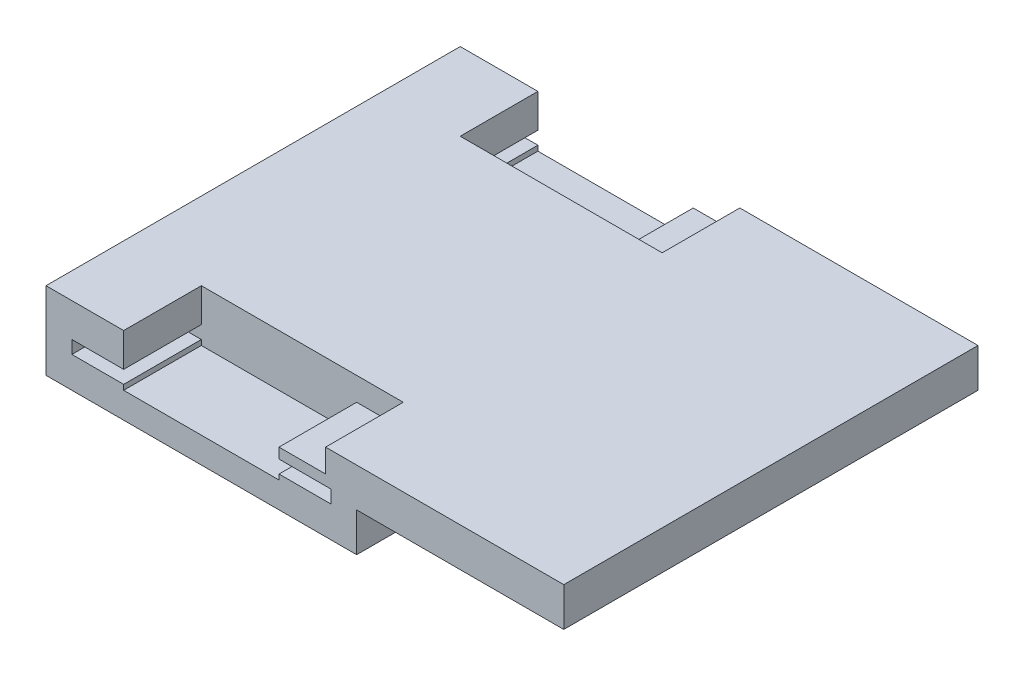
ISO-10303-21;
HEADER;
FILE_DESCRIPTION(('STEP AP214'),'2;1');
FILE_NAME('part.step','',(''),(''),'','','');
FILE_SCHEMA(('AUTOMOTIVE_DESIGN { 1 0 10303 214 1 1 1 1 }'));
ENDSEC;
DATA;
#1=APPLICATION_CONTEXT('core data for automotive mechanical design processes');
#2=APPLICATION_PROTOCOL_DEFINITION('international standard','automotive_design',2000,#1);
#3=PRODUCT_CONTEXT('',#1,'mechanical');
#4=PRODUCT('Part','Part','',(#3));
#5=PRODUCT_RELATED_PRODUCT_CATEGORY('part','',(#4));
#6=PRODUCT_DEFINITION_FORMATION('','',#4);
#7=PRODUCT_DEFINITION_CONTEXT('part definition',#1,'design');
#8=PRODUCT_DEFINITION('design','',#6,#7);
#9=PRODUCT_DEFINITION_SHAPE('','',#8);
#10=(LENGTH_UNIT() NAMED_UNIT(*) SI_UNIT(.MILLI.,.METRE.));
#11=(NAMED_UNIT(*) PLANE_ANGLE_UNIT() SI_UNIT($,.RADIAN.));
#12=(NAMED_UNIT(*) SI_UNIT($,.STERADIAN.) SOLID_ANGLE_UNIT());
#13=UNCERTAINTY_MEASURE_WITH_UNIT(LENGTH_MEASURE(1.E-05),#10,'distance_accuracy_value','');
#14=(GEOMETRIC_REPRESENTATION_CONTEXT(3) GLOBAL_UNCERTAINTY_ASSIGNED_CONTEXT((#13)) GLOBAL_UNIT_ASSIGNED_CONTEXT((#10,
#11,#12)) REPRESENTATION_CONTEXT('',''));
#15=CARTESIAN_POINT('',(0.,0.,0.));
#16=DIRECTION('',(0.,0.,1.));
#17=DIRECTION('',(1.,0.,0.));
#18=AXIS2_PLACEMENT_3D('',#15,#16,#17);
#19=CARTESIAN_POINT('',(0.,20.,0.));
#20=DIRECTION('',(0.,1.,0.));
#21=DIRECTION('',(0.,0.,1.));
#22=AXIS2_PLACEMENT_3D('',#19,#20,#21);
#23=PLANE('',#22);
#24=DIRECTION('',(0.,0.,-1.));
#25=VECTOR('',#24,1.);
#26=CARTESIAN_POINT('',(40.,20.,158.));
#27=LINE('',#26,#25);
#28=CARTESIAN_POINT('',(40.,20.,80.));
#29=VERTEX_POINT('',#28);
#30=CARTESIAN_POINT('',(40.,20.,-80.));
#31=VERTEX_POINT('',#30);
#32=EDGE_CURVE('E725',#29,#31,#27,.T.);
#33=ORIENTED_EDGE('',*,*,#32,.T.);
#34=DIRECTION('',(-1.,0.,0.));
#35=VECTOR('',#34,1.);
#36=CARTESIAN_POINT('',(-160.,20.,-80.));
#37=LINE('',#36,#35);
#38=CARTESIAN_POINT('',(-52.,20.,-80.));
#39=VERTEX_POINT('',#38);
#40=EDGE_CURVE('E522',#31,#39,#37,.T.);
#41=ORIENTED_EDGE('',*,*,#40,.T.);
#42=DIRECTION('',(0.,0.,-1.));
#43=VECTOR('',#42,1.);
#44=CARTESIAN_POINT('',(-52.,20.,-50.));
#45=LINE('',#44,#43);
#46=CARTESIAN_POINT('',(-52.,20.,-50.));
#47=VERTEX_POINT('',#46);
#48=EDGE_CURVE('E314',#47,#39,#45,.T.);
#49=ORIENTED_EDGE('',*,*,#48,.F.);
#50=DIRECTION('',(-1.,0.,0.));
#51=VECTOR('',#50,1.);
#52=CARTESIAN_POINT('',(-130.,20.,-50.));
#53=LINE('',#52,#51);
#54=CARTESIAN_POINT('',(-130.,20.,-50.));
#55=VERTEX_POINT('',#54);
#56=EDGE_CURVE('E403',#47,#55,#53,.T.);
#57=ORIENTED_EDGE('',*,*,#56,.T.);
#58=DIRECTION('',(0.,0.,-1.));
#59=VECTOR('',#58,1.);
#60=CARTESIAN_POINT('',(-130.,20.,-80.));
#61=LINE('',#60,#59);
#62=CARTESIAN_POINT('',(-130.,20.,-80.));
#63=VERTEX_POINT('',#62);
#64=EDGE_CURVE('E358',#55,#63,#61,.T.);
#65=ORIENTED_EDGE('',*,*,#64,.T.);
#66=CARTESIAN_POINT('',(-160.,20.,-80.));
#67=VERTEX_POINT('',#66);
#68=EDGE_CURVE('E506',#63,#67,#37,.T.);
#69=ORIENTED_EDGE('',*,*,#68,.T.);
#70=DIRECTION('',(0.,0.,1.));
#71=VECTOR('',#70,1.);
#72=CARTESIAN_POINT('',(-160.,20.,-80.));
#73=LINE('',#72,#71);
#74=CARTESIAN_POINT('',(-160.,20.,80.));
#75=VERTEX_POINT('',#74);
#76=EDGE_CURVE('E525',#67,#75,#73,.T.);
#77=ORIENTED_EDGE('',*,*,#76,.T.);
#78=DIRECTION('',(1.,0.,0.));
#79=VECTOR('',#78,1.);
#80=CARTESIAN_POINT('',(-160.,20.,80.));
#81=LINE('',#80,#79);
#82=CARTESIAN_POINT('',(-130.,20.,80.));
#83=VERTEX_POINT('',#82);
#84=EDGE_CURVE('E529',#75,#83,#81,.T.);
#85=ORIENTED_EDGE('',*,*,#84,.T.);
#86=DIRECTION('',(0.,0.,1.));
#87=VECTOR('',#86,1.);
#88=CARTESIAN_POINT('',(-130.,20.,80.));
#89=LINE('',#88,#87);
#90=CARTESIAN_POINT('',(-130.,20.,50.));
#91=VERTEX_POINT('',#90);
#92=EDGE_CURVE('E452',#91,#83,#89,.T.);
#93=ORIENTED_EDGE('',*,*,#92,.F.);
#94=DIRECTION('',(-1.,0.,0.));
#95=VECTOR('',#94,1.);
#96=CARTESIAN_POINT('',(-130.,20.,50.));
#97=LINE('',#96,#95);
#98=CARTESIAN_POINT('',(-52.,20.,50.));
#99=VERTEX_POINT('',#98);
#100=EDGE_CURVE('E497',#99,#91,#97,.T.);
#101=ORIENTED_EDGE('',*,*,#100,.F.);
#102=DIRECTION('',(0.,0.,1.));
#103=VECTOR('',#102,1.);
#104=CARTESIAN_POINT('',(-52.,20.,50.));
#105=LINE('',#104,#103);
#106=CARTESIAN_POINT('',(-52.,20.,80.));
#107=VERTEX_POINT('',#106);
#108=EDGE_CURVE('E304',#99,#107,#105,.T.);
#109=ORIENTED_EDGE('',*,*,#108,.T.);
#110=EDGE_CURVE('E528',#107,#29,#81,.T.);
#111=ORIENTED_EDGE('',*,*,#110,.T.);
#112=EDGE_LOOP('',(#33,#41,#49,#57,#65,#69,#77,#85,#93,#101,#109,#111));
#113=FACE_BOUND('',#112,.T.);
#114=ADVANCED_FACE('F46',(#113),#23,.T.);
#115=CARTESIAN_POINT('',(-160.,20.,80.));
#116=DIRECTION('',(0.,0.,-1.));
#117=DIRECTION('',(-1.,0.,0.));
#118=AXIS2_PLACEMENT_3D('',#115,#116,#117);
#119=PLANE('',#118);
#120=DIRECTION('',(1.,0.,0.));
#121=VECTOR('',#120,1.);
#122=CARTESIAN_POINT('',(-160.,5.,80.));
#123=LINE('',#122,#121);
#124=CARTESIAN_POINT('',(-40.,5.,80.));
#125=VERTEX_POINT('',#124);
#126=CARTESIAN_POINT('',(40.,5.,80.));
#127=VERTEX_POINT('',#126);
#128=EDGE_CURVE('E719',#125,#127,#123,.T.);
#129=ORIENTED_EDGE('',*,*,#128,.T.);
#130=DIRECTION('',(0.,1.,0.));
#131=VECTOR('',#130,1.);
#132=CARTESIAN_POINT('',(40.,20.,80.));
#133=LINE('',#132,#131);
#134=EDGE_CURVE('E714',#127,#29,#133,.T.);
#135=ORIENTED_EDGE('',*,*,#134,.T.);
#136=ORIENTED_EDGE('',*,*,#110,.F.);
#137=DIRECTION('',(0.,-1.,0.));
#138=VECTOR('',#137,1.);
#139=CARTESIAN_POINT('',(-52.,11.,80.));
#140=LINE('',#139,#138);
#141=CARTESIAN_POINT('',(-52.,11.,80.));
#142=VERTEX_POINT('',#141);
#143=EDGE_CURVE('E692',#107,#142,#140,.T.);
#144=ORIENTED_EDGE('',*,*,#143,.T.);
#145=DIRECTION('',(-1.,0.,0.));
#146=VECTOR('',#145,1.);
#147=CARTESIAN_POINT('',(-70.,11.,80.));
#148=LINE('',#147,#146);
#149=CARTESIAN_POINT('',(-70.,11.,80.));
#150=VERTEX_POINT('',#149);
#151=EDGE_CURVE('E712',#142,#150,#148,.T.);
#152=ORIENTED_EDGE('',*,*,#151,.T.);
#153=DIRECTION('',(0.,1.,0.));
#154=VECTOR('',#153,1.);
#155=CARTESIAN_POINT('',(-70.,-8.00000000000001,80.));
#156=LINE('',#155,#154);
#157=CARTESIAN_POINT('',(-70.,7.,80.));
#158=VERTEX_POINT('',#157);
#159=EDGE_CURVE('E517',#158,#150,#156,.T.);
#160=ORIENTED_EDGE('',*,*,#159,.F.);
#161=DIRECTION('',(-1.,0.,0.));
#162=VECTOR('',#161,1.);
#163=CARTESIAN_POINT('',(-70.,7.,80.));
#164=LINE('',#163,#162);
#165=CARTESIAN_POINT('',(-50.,7.,80.));
#166=VERTEX_POINT('',#165);
#167=EDGE_CURVE('E474',#166,#158,#164,.T.);
#168=ORIENTED_EDGE('',*,*,#167,.F.);
#169=DIRECTION('',(0.,1.,0.));
#170=VECTOR('',#169,1.);
#171=CARTESIAN_POINT('',(-50.,7.,80.));
#172=LINE('',#171,#170);
#173=CARTESIAN_POINT('',(-50.,2.,80.));
#174=VERTEX_POINT('',#173);
#175=EDGE_CURVE('E477',#174,#166,#172,.T.);
#176=ORIENTED_EDGE('',*,*,#175,.F.);
#177=DIRECTION('',(1.,0.,0.));
#178=VECTOR('',#177,1.);
#179=CARTESIAN_POINT('',(-70.,2.,80.));
#180=LINE('',#179,#178);
#181=CARTESIAN_POINT('',(-70.,2.,80.));
#182=VERTEX_POINT('',#181);
#183=EDGE_CURVE('E442',#182,#174,#180,.T.);
#184=ORIENTED_EDGE('',*,*,#183,.F.);
#185=CARTESIAN_POINT('',(-70.,0.,80.));
#186=VERTEX_POINT('',#185);
#187=EDGE_CURVE('E513',#186,#182,#156,.T.);
#188=ORIENTED_EDGE('',*,*,#187,.F.);
#189=DIRECTION('',(-1.,0.,0.));
#190=VECTOR('',#189,1.);
#191=CARTESIAN_POINT('',(-160.,0.,80.));
#192=LINE('',#191,#190);
#193=CARTESIAN_POINT('',(-130.,0.,80.));
#194=VERTEX_POINT('',#193);
#195=EDGE_CURVE('E296',#186,#194,#192,.T.);
#196=ORIENTED_EDGE('',*,*,#195,.T.);
#197=DIRECTION('',(0.,1.,0.));
#198=VECTOR('',#197,1.);
#199=CARTESIAN_POINT('',(-130.,-8.00000000000001,80.));
#200=LINE('',#199,#198);
#201=CARTESIAN_POINT('',(-130.,2.,80.));
#202=VERTEX_POINT('',#201);
#203=EDGE_CURVE('E518',#194,#202,#200,.T.);
#204=ORIENTED_EDGE('',*,*,#203,.T.);
#205=DIRECTION('',(1.,0.,0.));
#206=VECTOR('',#205,1.);
#207=CARTESIAN_POINT('',(-130.,2.,80.));
#208=LINE('',#207,#206);
#209=CARTESIAN_POINT('',(-150.,2.,80.));
#210=VERTEX_POINT('',#209);
#211=EDGE_CURVE('E429',#210,#202,#208,.T.);
#212=ORIENTED_EDGE('',*,*,#211,.F.);
#213=DIRECTION('',(0.,-1.,0.));
#214=VECTOR('',#213,1.);
#215=CARTESIAN_POINT('',(-150.,7.,80.));
#216=LINE('',#215,#214);
#217=CARTESIAN_POINT('',(-150.,7.,80.));
#218=VERTEX_POINT('',#217);
#219=EDGE_CURVE('E441',#218,#210,#216,.T.);
#220=ORIENTED_EDGE('',*,*,#219,.F.);
#221=DIRECTION('',(-1.,0.,0.));
#222=VECTOR('',#221,1.);
#223=CARTESIAN_POINT('',(-130.,7.,80.));
#224=LINE('',#223,#222);
#225=CARTESIAN_POINT('',(-130.,7.,80.));
#226=VERTEX_POINT('',#225);
#227=EDGE_CURVE('E437',#226,#218,#224,.T.);
#228=ORIENTED_EDGE('',*,*,#227,.F.);
#229=EDGE_CURVE('E501',#226,#83,#200,.T.);
#230=ORIENTED_EDGE('',*,*,#229,.T.);
#231=ORIENTED_EDGE('',*,*,#84,.F.);
#232=DIRECTION('',(0.,-1.,0.));
#233=VECTOR('',#232,1.);
#234=CARTESIAN_POINT('',(-160.,20.,80.));
#235=LINE('',#234,#233);
#236=CARTESIAN_POINT('',(-160.,-10.,80.));
#237=VERTEX_POINT('',#236);
#238=EDGE_CURVE('E533',#75,#237,#235,.T.);
#239=ORIENTED_EDGE('',*,*,#238,.T.);
#240=DIRECTION('',(-1.,0.,0.));
#241=VECTOR('',#240,1.);
#242=CARTESIAN_POINT('',(-160.,-10.,80.));
#243=LINE('',#242,#241);
#244=CARTESIAN_POINT('',(-40.,-10.,80.));
#245=VERTEX_POINT('',#244);
#246=EDGE_CURVE('E290',#245,#237,#243,.T.);
#247=ORIENTED_EDGE('',*,*,#246,.F.);
#248=DIRECTION('',(0.,1.,0.));
#249=VECTOR('',#248,1.);
#250=CARTESIAN_POINT('',(-40.,19.9999999999999,80.));
#251=LINE('',#250,#249);
#252=EDGE_CURVE('E61',#245,#125,#251,.T.);
#253=ORIENTED_EDGE('',*,*,#252,.T.);
#254=EDGE_LOOP('',(#129,#135,#136,#144,#152,#160,#168,#176,#184,#188,#196,#204,#212,#220,#228,
#230,#231,#239,#247,#253));
#255=FACE_BOUND('',#254,.T.);
#256=ADVANCED_FACE('F648',(#255),#119,.F.);
#257=CARTESIAN_POINT('',(-70.,-8.00000000000001,80.));
#258=DIRECTION('',(1.,0.,0.));
#259=DIRECTION('',(0.,0.,-1.));
#260=AXIS2_PLACEMENT_3D('',#257,#258,#259);
#261=PLANE('',#260);
#262=DIRECTION('',(0.,0.,1.));
#263=VECTOR('',#262,1.);
#264=CARTESIAN_POINT('',(-70.,11.,50.));
#265=LINE('',#264,#263);
#266=CARTESIAN_POINT('',(-70.,11.,50.));
#267=VERTEX_POINT('',#266);
#268=EDGE_CURVE('E697',#267,#150,#265,.T.);
#269=ORIENTED_EDGE('',*,*,#268,.F.);
#270=DIRECTION('',(0.,1.,0.));
#271=VECTOR('',#270,1.);
#272=CARTESIAN_POINT('',(-70.,-8.00000000000001,50.));
#273=LINE('',#272,#271);
#274=CARTESIAN_POINT('',(-70.,7.,50.));
#275=VERTEX_POINT('',#274);
#276=EDGE_CURVE('E512',#275,#267,#273,.T.);
#277=ORIENTED_EDGE('',*,*,#276,.F.);
#278=DIRECTION('',(0.,0.,1.));
#279=VECTOR('',#278,1.);
#280=CARTESIAN_POINT('',(-70.,7.,50.));
#281=LINE('',#280,#279);
#282=EDGE_CURVE('E423',#275,#158,#281,.T.);
#283=ORIENTED_EDGE('',*,*,#282,.T.);
#284=ORIENTED_EDGE('',*,*,#159,.T.);
#285=EDGE_LOOP('',(#269,#277,#283,#284));
#286=FACE_BOUND('',#285,.T.);
#287=ADVANCED_FACE('F654',(#286),#261,.F.);
#288=CARTESIAN_POINT('',(-130.,-8.00000000000001,-80.));
#289=DIRECTION('',(1.,0.,0.));
#290=DIRECTION('',(0.,0.,-1.));
#291=AXIS2_PLACEMENT_3D('',#288,#289,#290);
#292=PLANE('',#291);
#293=DIRECTION('',(0.,1.,0.));
#294=VECTOR('',#293,1.);
#295=CARTESIAN_POINT('',(-130.,-8.00000000000001,-50.));
#296=LINE('',#295,#294);
#297=CARTESIAN_POINT('',(-130.,7.,-50.));
#298=VERTEX_POINT('',#297);
#299=EDGE_CURVE('E407',#298,#55,#296,.T.);
#300=ORIENTED_EDGE('',*,*,#299,.F.);
#301=DIRECTION('',(0.,0.,-1.));
#302=VECTOR('',#301,1.);
#303=CARTESIAN_POINT('',(-130.,7.,-50.));
#304=LINE('',#303,#302);
#305=CARTESIAN_POINT('',(-130.,7.,-80.));
#306=VERTEX_POINT('',#305);
#307=EDGE_CURVE('E354',#298,#306,#304,.T.);
#308=ORIENTED_EDGE('',*,*,#307,.T.);
#309=DIRECTION('',(0.,1.,0.));
#310=VECTOR('',#309,1.);
#311=CARTESIAN_POINT('',(-130.,20.,-80.));
#312=LINE('',#311,#310);
#313=EDGE_CURVE('E556',#306,#63,#312,.T.);
#314=ORIENTED_EDGE('',*,*,#313,.T.);
#315=ORIENTED_EDGE('',*,*,#64,.F.);
#316=EDGE_LOOP('',(#300,#308,#314,#315));
#317=FACE_BOUND('',#316,.T.);
#318=ADVANCED_FACE('F592',(#317),#292,.T.);
#319=CARTESIAN_POINT('',(-130.,0.,-80.));
#320=VERTEX_POINT('',#319);
#321=CARTESIAN_POINT('',(-130.,2.,-80.));
#322=VERTEX_POINT('',#321);
#323=EDGE_CURVE('E557',#320,#322,#312,.T.);
#324=ORIENTED_EDGE('',*,*,#323,.T.);
#325=DIRECTION('',(0.,0.,-1.));
#326=VECTOR('',#325,1.);
#327=CARTESIAN_POINT('',(-130.,2.,-50.));
#328=LINE('',#327,#326);
#329=CARTESIAN_POINT('',(-130.,2.,-50.));
#330=VERTEX_POINT('',#329);
#331=EDGE_CURVE('E341',#330,#322,#328,.T.);
#332=ORIENTED_EDGE('',*,*,#331,.F.);
#333=CARTESIAN_POINT('',(-130.,0.,-50.));
#334=VERTEX_POINT('',#333);
#335=EDGE_CURVE('E414',#334,#330,#296,.T.);
#336=ORIENTED_EDGE('',*,*,#335,.F.);
#337=DIRECTION('',(0.,0.,-1.));
#338=VECTOR('',#337,1.);
#339=CARTESIAN_POINT('',(-130.,0.,0.));
#340=LINE('',#339,#338);
#341=EDGE_CURVE('E420',#334,#320,#340,.T.);
#342=ORIENTED_EDGE('',*,*,#341,.T.);
#343=EDGE_LOOP('',(#324,#332,#336,#342));
#344=FACE_BOUND('',#343,.T.);
#345=ADVANCED_FACE('F572',(#344),#292,.T.);
#346=CARTESIAN_POINT('',(-70.,-8.00000000000001,-80.));
#347=DIRECTION('',(-1.,0.,0.));
#348=DIRECTION('',(0.,0.,1.));
#349=AXIS2_PLACEMENT_3D('',#346,#347,#348);
#350=PLANE('',#349);
#351=DIRECTION('',(0.,1.,0.));
#352=VECTOR('',#351,1.);
#353=CARTESIAN_POINT('',(-70.,-8.00000000000001,-50.));
#354=LINE('',#353,#352);
#355=CARTESIAN_POINT('',(-70.,0.,-50.));
#356=VERTEX_POINT('',#355);
#357=CARTESIAN_POINT('',(-70.,2.,-50.));
#358=VERTEX_POINT('',#357);
#359=EDGE_CURVE('E408',#356,#358,#354,.T.);
#360=ORIENTED_EDGE('',*,*,#359,.T.);
#361=DIRECTION('',(0.,0.,-1.));
#362=VECTOR('',#361,1.);
#363=CARTESIAN_POINT('',(-70.,2.,-50.));
#364=LINE('',#363,#362);
#365=CARTESIAN_POINT('',(-70.,2.,-80.));
#366=VERTEX_POINT('',#365);
#367=EDGE_CURVE('E347',#358,#366,#364,.T.);
#368=ORIENTED_EDGE('',*,*,#367,.T.);
#369=DIRECTION('',(0.,-1.,0.));
#370=VECTOR('',#369,1.);
#371=CARTESIAN_POINT('',(-70.,20.,-80.));
#372=LINE('',#371,#370);
#373=CARTESIAN_POINT('',(-70.,0.,-80.));
#374=VERTEX_POINT('',#373);
#375=EDGE_CURVE('E552',#366,#374,#372,.T.);
#376=ORIENTED_EDGE('',*,*,#375,.T.);
#377=DIRECTION('',(0.,0.,1.));
#378=VECTOR('',#377,1.);
#379=CARTESIAN_POINT('',(-70.,0.,0.));
#380=LINE('',#379,#378);
#381=EDGE_CURVE('E412',#374,#356,#380,.T.);
#382=ORIENTED_EDGE('',*,*,#381,.T.);
#383=EDGE_LOOP('',(#360,#368,#376,#382));
#384=FACE_BOUND('',#383,.T.);
#385=ADVANCED_FACE('F636',(#384),#350,.T.);
#386=DIRECTION('',(0.,0.,-1.));
#387=VECTOR('',#386,1.);
#388=CARTESIAN_POINT('',(-70.,11.,-50.));
#389=LINE('',#388,#387);
#390=CARTESIAN_POINT('',(-70.,11.,-50.));
#391=VERTEX_POINT('',#390);
#392=CARTESIAN_POINT('',(-70.,11.,-80.));
#393=VERTEX_POINT('',#392);
#394=EDGE_CURVE('E320',#391,#393,#389,.T.);
#395=ORIENTED_EDGE('',*,*,#394,.T.);
#396=CARTESIAN_POINT('',(-70.,7.,-80.));
#397=VERTEX_POINT('',#396);
#398=EDGE_CURVE('E553',#393,#397,#372,.T.);
#399=ORIENTED_EDGE('',*,*,#398,.T.);
#400=DIRECTION('',(0.,0.,-1.));
#401=VECTOR('',#400,1.);
#402=CARTESIAN_POINT('',(-70.,7.,-50.));
#403=LINE('',#402,#401);
#404=CARTESIAN_POINT('',(-70.,7.,-50.));
#405=VERTEX_POINT('',#404);
#406=EDGE_CURVE('E377',#405,#397,#403,.T.);
#407=ORIENTED_EDGE('',*,*,#406,.F.);
#408=EDGE_CURVE('E413',#405,#391,#354,.T.);
#409=ORIENTED_EDGE('',*,*,#408,.T.);
#410=EDGE_LOOP('',(#395,#399,#407,#409));
#411=FACE_BOUND('',#410,.T.);
#412=ADVANCED_FACE('F621',(#411),#350,.T.);
#413=CARTESIAN_POINT('',(-160.,20.,-80.));
#414=DIRECTION('',(0.,0.,1.));
#415=DIRECTION('',(1.,0.,0.));
#416=AXIS2_PLACEMENT_3D('',#413,#414,#415);
#417=PLANE('',#416);
#418=ORIENTED_EDGE('',*,*,#40,.F.);
#419=DIRECTION('',(0.,1.,0.));
#420=VECTOR('',#419,1.);
#421=CARTESIAN_POINT('',(40.,20.,-80.));
#422=LINE('',#421,#420);
#423=CARTESIAN_POINT('',(40.,5.,-80.));
#424=VERTEX_POINT('',#423);
#425=EDGE_CURVE('E730',#424,#31,#422,.T.);
#426=ORIENTED_EDGE('',*,*,#425,.F.);
#427=DIRECTION('',(1.,0.,0.));
#428=VECTOR('',#427,1.);
#429=CARTESIAN_POINT('',(40.,5.,-80.));
#430=LINE('',#429,#428);
#431=CARTESIAN_POINT('',(-40.,5.,-80.));
#432=VERTEX_POINT('',#431);
#433=EDGE_CURVE('E283',#432,#424,#430,.T.);
#434=ORIENTED_EDGE('',*,*,#433,.F.);
#435=DIRECTION('',(0.,1.,0.));
#436=VECTOR('',#435,1.);
#437=CARTESIAN_POINT('',(-40.,5.,-80.));
#438=LINE('',#437,#436);
#439=CARTESIAN_POINT('',(-40.,-10.,-80.));
#440=VERTEX_POINT('',#439);
#441=EDGE_CURVE('E270',#440,#432,#438,.T.);
#442=ORIENTED_EDGE('',*,*,#441,.F.);
#443=DIRECTION('',(1.,0.,0.));
#444=VECTOR('',#443,1.);
#445=CARTESIAN_POINT('',(-160.,-10.,-80.));
#446=LINE('',#445,#444);
#447=CARTESIAN_POINT('',(-160.,-10.,-80.));
#448=VERTEX_POINT('',#447);
#449=EDGE_CURVE('E279',#448,#440,#446,.T.);
#450=ORIENTED_EDGE('',*,*,#449,.F.);
#451=DIRECTION('',(0.,-1.,0.));
#452=VECTOR('',#451,1.);
#453=CARTESIAN_POINT('',(-160.,20.,-80.));
#454=LINE('',#453,#452);
#455=EDGE_CURVE('E537',#67,#448,#454,.T.);
#456=ORIENTED_EDGE('',*,*,#455,.F.);
#457=ORIENTED_EDGE('',*,*,#68,.F.);
#458=ORIENTED_EDGE('',*,*,#313,.F.);
#459=DIRECTION('',(-1.,0.,0.));
#460=VECTOR('',#459,1.);
#461=CARTESIAN_POINT('',(-130.,7.,-80.));
#462=LINE('',#461,#460);
#463=CARTESIAN_POINT('',(-150.,7.,-80.));
#464=VERTEX_POINT('',#463);
#465=EDGE_CURVE('E335',#306,#464,#462,.T.);
#466=ORIENTED_EDGE('',*,*,#465,.T.);
#467=DIRECTION('',(0.,-1.,0.));
#468=VECTOR('',#467,1.);
#469=CARTESIAN_POINT('',(-150.,7.,-80.));
#470=LINE('',#469,#468);
#471=CARTESIAN_POINT('',(-150.,2.,-80.));
#472=VERTEX_POINT('',#471);
#473=EDGE_CURVE('E346',#464,#472,#470,.T.);
#474=ORIENTED_EDGE('',*,*,#473,.T.);
#475=DIRECTION('',(1.,0.,0.));
#476=VECTOR('',#475,1.);
#477=CARTESIAN_POINT('',(-130.,2.,-80.));
#478=LINE('',#477,#476);
#479=EDGE_CURVE('E342',#472,#322,#478,.T.);
#480=ORIENTED_EDGE('',*,*,#479,.T.);
#481=ORIENTED_EDGE('',*,*,#323,.F.);
#482=DIRECTION('',(1.,0.,0.));
#483=VECTOR('',#482,1.);
#484=CARTESIAN_POINT('',(-160.,0.,-80.));
#485=LINE('',#484,#483);
#486=EDGE_CURVE('E300',#320,#374,#485,.T.);
#487=ORIENTED_EDGE('',*,*,#486,.T.);
#488=ORIENTED_EDGE('',*,*,#375,.F.);
#489=DIRECTION('',(1.,0.,0.));
#490=VECTOR('',#489,1.);
#491=CARTESIAN_POINT('',(-70.,2.,-80.));
#492=LINE('',#491,#490);
#493=CARTESIAN_POINT('',(-50.,2.,-80.));
#494=VERTEX_POINT('',#493);
#495=EDGE_CURVE('E371',#366,#494,#492,.T.);
#496=ORIENTED_EDGE('',*,*,#495,.T.);
#497=DIRECTION('',(0.,1.,0.));
#498=VECTOR('',#497,1.);
#499=CARTESIAN_POINT('',(-50.,7.,-80.));
#500=LINE('',#499,#498);
#501=CARTESIAN_POINT('',(-50.,7.,-80.));
#502=VERTEX_POINT('',#501);
#503=EDGE_CURVE('E381',#494,#502,#500,.T.);
#504=ORIENTED_EDGE('',*,*,#503,.T.);
#505=DIRECTION('',(-1.,0.,0.));
#506=VECTOR('',#505,1.);
#507=CARTESIAN_POINT('',(-70.,7.,-80.));
#508=LINE('',#507,#506);
#509=EDGE_CURVE('E324',#502,#397,#508,.T.);
#510=ORIENTED_EDGE('',*,*,#509,.T.);
#511=ORIENTED_EDGE('',*,*,#398,.F.);
#512=DIRECTION('',(-1.,0.,0.));
#513=VECTOR('',#512,1.);
#514=CARTESIAN_POINT('',(-70.,11.,-80.));
#515=LINE('',#514,#513);
#516=CARTESIAN_POINT('',(-52.,11.,-80.));
#517=VERTEX_POINT('',#516);
#518=EDGE_CURVE('E311',#517,#393,#515,.T.);
#519=ORIENTED_EDGE('',*,*,#518,.F.);
#520=DIRECTION('',(0.,-1.,0.));
#521=VECTOR('',#520,1.);
#522=CARTESIAN_POINT('',(-52.,11.,-80.));
#523=LINE('',#522,#521);
#524=EDGE_CURVE('E294',#39,#517,#523,.T.);
#525=ORIENTED_EDGE('',*,*,#524,.F.);
#526=EDGE_LOOP('',(#418,#426,#434,#442,#450,#456,#457,#458,#466,#474,#480,#481,#487,#488,#496,
#504,#510,#511,#519,#525));
#527=FACE_BOUND('',#526,.T.);
#528=ADVANCED_FACE('F48',(#527),#417,.F.);
#529=CARTESIAN_POINT('',(-130.,-8.00000000000001,80.));
#530=DIRECTION('',(-1.,0.,0.));
#531=DIRECTION('',(0.,0.,1.));
#532=AXIS2_PLACEMENT_3D('',#529,#530,#531);
#533=PLANE('',#532);
#534=DIRECTION('',(0.,1.,0.));
#535=VECTOR('',#534,1.);
#536=CARTESIAN_POINT('',(-130.,-8.00000000000001,50.));
#537=LINE('',#536,#535);
#538=CARTESIAN_POINT('',(-130.,0.,50.));
#539=VERTEX_POINT('',#538);
#540=CARTESIAN_POINT('',(-130.,2.,50.));
#541=VERTEX_POINT('',#540);
#542=EDGE_CURVE('E502',#539,#541,#537,.T.);
#543=ORIENTED_EDGE('',*,*,#542,.T.);
#544=DIRECTION('',(0.,0.,1.));
#545=VECTOR('',#544,1.);
#546=CARTESIAN_POINT('',(-130.,2.,50.));
#547=LINE('',#546,#545);
#548=EDGE_CURVE('E448',#541,#202,#547,.T.);
#549=ORIENTED_EDGE('',*,*,#548,.T.);
#550=ORIENTED_EDGE('',*,*,#203,.F.);
#551=DIRECTION('',(0.,0.,1.));
#552=VECTOR('',#551,1.);
#553=CARTESIAN_POINT('',(-130.,0.,0.));
#554=LINE('',#553,#552);
#555=EDGE_CURVE('E548',#539,#194,#554,.T.);
#556=ORIENTED_EDGE('',*,*,#555,.F.);
#557=EDGE_LOOP('',(#543,#549,#550,#556));
#558=FACE_BOUND('',#557,.T.);
#559=ADVANCED_FACE('F662',(#558),#533,.F.);
#560=CARTESIAN_POINT('',(-160.,20.,-80.));
#561=DIRECTION('',(1.,0.,0.));
#562=DIRECTION('',(0.,0.,-1.));
#563=AXIS2_PLACEMENT_3D('',#560,#561,#562);
#564=PLANE('',#563);
#565=ORIENTED_EDGE('',*,*,#455,.T.);
#566=DIRECTION('',(0.,0.,-1.));
#567=VECTOR('',#566,1.);
#568=CARTESIAN_POINT('',(-160.,-10.,80.));
#569=LINE('',#568,#567);
#570=EDGE_CURVE('E288',#237,#448,#569,.T.);
#571=ORIENTED_EDGE('',*,*,#570,.F.);
#572=ORIENTED_EDGE('',*,*,#238,.F.);
#573=ORIENTED_EDGE('',*,*,#76,.F.);
#574=EDGE_LOOP('',(#565,#571,#572,#573));
#575=FACE_BOUND('',#574,.T.);
#576=ADVANCED_FACE('F660',(#575),#564,.F.);
#577=ORIENTED_EDGE('',*,*,#229,.F.);
#578=DIRECTION('',(0.,0.,1.));
#579=VECTOR('',#578,1.);
#580=CARTESIAN_POINT('',(-130.,7.,50.));
#581=LINE('',#580,#579);
#582=CARTESIAN_POINT('',(-130.,7.,50.));
#583=VERTEX_POINT('',#582);
#584=EDGE_CURVE('E436',#583,#226,#581,.T.);
#585=ORIENTED_EDGE('',*,*,#584,.F.);
#586=EDGE_CURVE('E507',#583,#91,#537,.T.);
#587=ORIENTED_EDGE('',*,*,#586,.T.);
#588=ORIENTED_EDGE('',*,*,#92,.T.);
#589=EDGE_LOOP('',(#577,#585,#587,#588));
#590=FACE_BOUND('',#589,.T.);
#591=ADVANCED_FACE('F658',(#590),#533,.F.);
#592=CARTESIAN_POINT('',(-130.,-8.00000000000001,50.));
#593=DIRECTION('',(0.,0.,-1.));
#594=DIRECTION('',(-1.,0.,0.));
#595=AXIS2_PLACEMENT_3D('',#592,#593,#594);
#596=PLANE('',#595);
#597=CARTESIAN_POINT('',(-70.,0.,50.));
#598=VERTEX_POINT('',#597);
#599=CARTESIAN_POINT('',(-70.,2.,50.));
#600=VERTEX_POINT('',#599);
#601=EDGE_CURVE('E508',#598,#600,#273,.T.);
#602=ORIENTED_EDGE('',*,*,#601,.T.);
#603=DIRECTION('',(1.,0.,0.));
#604=VECTOR('',#603,1.);
#605=CARTESIAN_POINT('',(-70.,2.,50.));
#606=LINE('',#605,#604);
#607=CARTESIAN_POINT('',(-50.,2.,50.));
#608=VERTEX_POINT('',#607);
#609=EDGE_CURVE('E478',#600,#608,#606,.T.);
#610=ORIENTED_EDGE('',*,*,#609,.T.);
#611=DIRECTION('',(0.,1.,0.));
#612=VECTOR('',#611,1.);
#613=CARTESIAN_POINT('',(-50.,7.,50.));
#614=LINE('',#613,#612);
#615=CARTESIAN_POINT('',(-50.,7.,50.));
#616=VERTEX_POINT('',#615);
#617=EDGE_CURVE('E487',#608,#616,#614,.T.);
#618=ORIENTED_EDGE('',*,*,#617,.T.);
#619=DIRECTION('',(-1.,0.,0.));
#620=VECTOR('',#619,1.);
#621=CARTESIAN_POINT('',(-70.,7.,50.));
#622=LINE('',#621,#620);
#623=EDGE_CURVE('E464',#616,#275,#622,.T.);
#624=ORIENTED_EDGE('',*,*,#623,.T.);
#625=ORIENTED_EDGE('',*,*,#276,.T.);
#626=DIRECTION('',(-1.,0.,0.));
#627=VECTOR('',#626,1.);
#628=CARTESIAN_POINT('',(-70.,11.,50.));
#629=LINE('',#628,#627);
#630=CARTESIAN_POINT('',(-52.,11.,50.));
#631=VERTEX_POINT('',#630);
#632=EDGE_CURVE('E707',#631,#267,#629,.T.);
#633=ORIENTED_EDGE('',*,*,#632,.F.);
#634=DIRECTION('',(0.,-1.,0.));
#635=VECTOR('',#634,1.);
#636=CARTESIAN_POINT('',(-52.,11.,50.));
#637=LINE('',#636,#635);
#638=EDGE_CURVE('E684',#99,#631,#637,.T.);
#639=ORIENTED_EDGE('',*,*,#638,.F.);
#640=ORIENTED_EDGE('',*,*,#100,.T.);
#641=ORIENTED_EDGE('',*,*,#586,.F.);
#642=DIRECTION('',(-1.,0.,0.));
#643=VECTOR('',#642,1.);
#644=CARTESIAN_POINT('',(-130.,7.,50.));
#645=LINE('',#644,#643);
#646=CARTESIAN_POINT('',(-150.,7.,50.));
#647=VERTEX_POINT('',#646);
#648=EDGE_CURVE('E424',#583,#647,#645,.T.);
#649=ORIENTED_EDGE('',*,*,#648,.T.);
#650=DIRECTION('',(0.,-1.,0.));
#651=VECTOR('',#650,1.);
#652=CARTESIAN_POINT('',(-150.,7.,50.));
#653=LINE('',#652,#651);
#654=CARTESIAN_POINT('',(-150.,2.,50.));
#655=VERTEX_POINT('',#654);
#656=EDGE_CURVE('E428',#647,#655,#653,.T.);
#657=ORIENTED_EDGE('',*,*,#656,.T.);
#658=DIRECTION('',(1.,0.,0.));
#659=VECTOR('',#658,1.);
#660=CARTESIAN_POINT('',(-130.,2.,50.));
#661=LINE('',#660,#659);
#662=EDGE_CURVE('E433',#655,#541,#661,.T.);
#663=ORIENTED_EDGE('',*,*,#662,.T.);
#664=ORIENTED_EDGE('',*,*,#542,.F.);
#665=DIRECTION('',(-1.,0.,0.));
#666=VECTOR('',#665,1.);
#667=CARTESIAN_POINT('',(0.,0.,50.));
#668=LINE('',#667,#666);
#669=EDGE_CURVE('E544',#598,#539,#668,.T.);
#670=ORIENTED_EDGE('',*,*,#669,.F.);
#671=EDGE_LOOP('',(#602,#610,#618,#624,#625,#633,#639,#640,#641,#649,#657,#663,#664,#670));
#672=FACE_BOUND('',#671,.T.);
#673=ADVANCED_FACE('F668',(#672),#596,.F.);
#674=ORIENTED_EDGE('',*,*,#187,.T.);
#675=DIRECTION('',(0.,0.,1.));
#676=VECTOR('',#675,1.);
#677=CARTESIAN_POINT('',(-70.,2.,50.));
#678=LINE('',#677,#676);
#679=EDGE_CURVE('E461',#600,#182,#678,.T.);
#680=ORIENTED_EDGE('',*,*,#679,.F.);
#681=ORIENTED_EDGE('',*,*,#601,.F.);
#682=DIRECTION('',(0.,0.,-1.));
#683=VECTOR('',#682,1.);
#684=CARTESIAN_POINT('',(-70.,0.,0.));
#685=LINE('',#684,#683);
#686=EDGE_CURVE('E540',#186,#598,#685,.T.);
#687=ORIENTED_EDGE('',*,*,#686,.F.);
#688=EDGE_LOOP('',(#674,#680,#681,#687));
#689=FACE_BOUND('',#688,.T.);
#690=ADVANCED_FACE('F869',(#689),#261,.F.);
#691=CARTESIAN_POINT('',(-70.,7.,50.));
#692=DIRECTION('',(0.,1.,0.));
#693=DIRECTION('',(0.,0.,1.));
#694=AXIS2_PLACEMENT_3D('',#691,#692,#693);
#695=PLANE('',#694);
#696=ORIENTED_EDGE('',*,*,#167,.T.);
#697=ORIENTED_EDGE('',*,*,#282,.F.);
#698=ORIENTED_EDGE('',*,*,#623,.F.);
#699=DIRECTION('',(0.,0.,1.));
#700=VECTOR('',#699,1.);
#701=CARTESIAN_POINT('',(-50.,7.,50.));
#702=LINE('',#701,#700);
#703=EDGE_CURVE('E468',#616,#166,#702,.T.);
#704=ORIENTED_EDGE('',*,*,#703,.T.);
#705=EDGE_LOOP('',(#696,#697,#698,#704));
#706=FACE_BOUND('',#705,.T.);
#707=ADVANCED_FACE('F926',(#706),#695,.F.);
#708=CARTESIAN_POINT('',(-50.,7.,50.));
#709=DIRECTION('',(1.,0.,0.));
#710=DIRECTION('',(0.,0.,-1.));
#711=AXIS2_PLACEMENT_3D('',#708,#709,#710);
#712=PLANE('',#711);
#713=ORIENTED_EDGE('',*,*,#175,.T.);
#714=ORIENTED_EDGE('',*,*,#703,.F.);
#715=ORIENTED_EDGE('',*,*,#617,.F.);
#716=DIRECTION('',(0.,0.,1.));
#717=VECTOR('',#716,1.);
#718=CARTESIAN_POINT('',(-50.,2.,50.));
#719=LINE('',#718,#717);
#720=EDGE_CURVE('E465',#608,#174,#719,.T.);
#721=ORIENTED_EDGE('',*,*,#720,.T.);
#722=EDGE_LOOP('',(#713,#714,#715,#721));
#723=FACE_BOUND('',#722,.T.);
#724=ADVANCED_FACE('F950',(#723),#712,.F.);
#725=CARTESIAN_POINT('',(-70.,2.,50.));
#726=DIRECTION('',(0.,-1.,0.));
#727=DIRECTION('',(0.,0.,-1.));
#728=AXIS2_PLACEMENT_3D('',#725,#726,#727);
#729=PLANE('',#728);
#730=ORIENTED_EDGE('',*,*,#183,.T.);
#731=ORIENTED_EDGE('',*,*,#720,.F.);
#732=ORIENTED_EDGE('',*,*,#609,.F.);
#733=ORIENTED_EDGE('',*,*,#679,.T.);
#734=EDGE_LOOP('',(#730,#731,#732,#733));
#735=FACE_BOUND('',#734,.T.);
#736=ADVANCED_FACE('F960',(#735),#729,.F.);
#737=CARTESIAN_POINT('',(-130.,2.,50.));
#738=DIRECTION('',(0.,-1.,0.));
#739=DIRECTION('',(1.,0.,0.));
#740=AXIS2_PLACEMENT_3D('',#737,#738,#739);
#741=PLANE('',#740);
#742=ORIENTED_EDGE('',*,*,#211,.T.);
#743=ORIENTED_EDGE('',*,*,#548,.F.);
#744=ORIENTED_EDGE('',*,*,#662,.F.);
#745=DIRECTION('',(0.,0.,1.));
#746=VECTOR('',#745,1.);
#747=CARTESIAN_POINT('',(-150.,2.,50.));
#748=LINE('',#747,#746);
#749=EDGE_CURVE('E453',#655,#210,#748,.T.);
#750=ORIENTED_EDGE('',*,*,#749,.T.);
#751=EDGE_LOOP('',(#742,#743,#744,#750));
#752=FACE_BOUND('',#751,.T.);
#753=ADVANCED_FACE('F970',(#752),#741,.F.);
#754=CARTESIAN_POINT('',(-150.,7.,50.));
#755=DIRECTION('',(-1.,0.,0.));
#756=DIRECTION('',(0.,0.,1.));
#757=AXIS2_PLACEMENT_3D('',#754,#755,#756);
#758=PLANE('',#757);
#759=ORIENTED_EDGE('',*,*,#219,.T.);
#760=ORIENTED_EDGE('',*,*,#749,.F.);
#761=ORIENTED_EDGE('',*,*,#656,.F.);
#762=DIRECTION('',(0.,0.,1.));
#763=VECTOR('',#762,1.);
#764=CARTESIAN_POINT('',(-150.,7.,50.));
#765=LINE('',#764,#763);
#766=EDGE_CURVE('E456',#647,#218,#765,.T.);
#767=ORIENTED_EDGE('',*,*,#766,.T.);
#768=EDGE_LOOP('',(#759,#760,#761,#767));
#769=FACE_BOUND('',#768,.T.);
#770=ADVANCED_FACE('F980',(#769),#758,.F.);
#771=CARTESIAN_POINT('',(-130.,7.,50.));
#772=DIRECTION('',(0.,1.,0.));
#773=DIRECTION('',(-1.,0.,0.));
#774=AXIS2_PLACEMENT_3D('',#771,#772,#773);
#775=PLANE('',#774);
#776=ORIENTED_EDGE('',*,*,#227,.T.);
#777=ORIENTED_EDGE('',*,*,#766,.F.);
#778=ORIENTED_EDGE('',*,*,#648,.F.);
#779=ORIENTED_EDGE('',*,*,#584,.T.);
#780=EDGE_LOOP('',(#776,#777,#778,#779));
#781=FACE_BOUND('',#780,.T.);
#782=ADVANCED_FACE('F921',(#781),#775,.F.);
#783=CARTESIAN_POINT('',(-130.,-8.00000000000001,-50.));
#784=DIRECTION('',(0.,0.,-1.));
#785=DIRECTION('',(-1.,0.,0.));
#786=AXIS2_PLACEMENT_3D('',#783,#784,#785);
#787=PLANE('',#786);
#788=DIRECTION('',(-1.,0.,0.));
#789=VECTOR('',#788,1.);
#790=CARTESIAN_POINT('',(0.,0.,-50.));
#791=LINE('',#790,#789);
#792=EDGE_CURVE('E55',#356,#334,#791,.T.);
#793=ORIENTED_EDGE('',*,*,#792,.T.);
#794=ORIENTED_EDGE('',*,*,#335,.T.);
#795=DIRECTION('',(1.,0.,0.));
#796=VECTOR('',#795,1.);
#797=CARTESIAN_POINT('',(-130.,2.,-50.));
#798=LINE('',#797,#796);
#799=CARTESIAN_POINT('',(-150.,2.,-50.));
#800=VERTEX_POINT('',#799);
#801=EDGE_CURVE('E331',#800,#330,#798,.T.);
#802=ORIENTED_EDGE('',*,*,#801,.F.);
#803=DIRECTION('',(0.,-1.,0.));
#804=VECTOR('',#803,1.);
#805=CARTESIAN_POINT('',(-150.,7.,-50.));
#806=LINE('',#805,#804);
#807=CARTESIAN_POINT('',(-150.,7.,-50.));
#808=VERTEX_POINT('',#807);
#809=EDGE_CURVE('E334',#808,#800,#806,.T.);
#810=ORIENTED_EDGE('',*,*,#809,.F.);
#811=DIRECTION('',(-1.,0.,0.));
#812=VECTOR('',#811,1.);
#813=CARTESIAN_POINT('',(-130.,7.,-50.));
#814=LINE('',#813,#812);
#815=EDGE_CURVE('E338',#298,#808,#814,.T.);
#816=ORIENTED_EDGE('',*,*,#815,.F.);
#817=ORIENTED_EDGE('',*,*,#299,.T.);
#818=ORIENTED_EDGE('',*,*,#56,.F.);
#819=DIRECTION('',(0.,-1.,0.));
#820=VECTOR('',#819,1.);
#821=CARTESIAN_POINT('',(-52.,11.,-50.));
#822=LINE('',#821,#820);
#823=CARTESIAN_POINT('',(-52.,11.,-50.));
#824=VERTEX_POINT('',#823);
#825=EDGE_CURVE('E308',#47,#824,#822,.T.);
#826=ORIENTED_EDGE('',*,*,#825,.T.);
#827=DIRECTION('',(-1.,0.,0.));
#828=VECTOR('',#827,1.);
#829=CARTESIAN_POINT('',(-70.,11.,-50.));
#830=LINE('',#829,#828);
#831=EDGE_CURVE('E69',#824,#391,#830,.T.);
#832=ORIENTED_EDGE('',*,*,#831,.T.);
#833=ORIENTED_EDGE('',*,*,#408,.F.);
#834=DIRECTION('',(-1.,0.,0.));
#835=VECTOR('',#834,1.);
#836=CARTESIAN_POINT('',(-70.,7.,-50.));
#837=LINE('',#836,#835);
#838=CARTESIAN_POINT('',(-50.,7.,-50.));
#839=VERTEX_POINT('',#838);
#840=EDGE_CURVE('E367',#839,#405,#837,.T.);
#841=ORIENTED_EDGE('',*,*,#840,.F.);
#842=DIRECTION('',(0.,1.,0.));
#843=VECTOR('',#842,1.);
#844=CARTESIAN_POINT('',(-50.,7.,-50.));
#845=LINE('',#844,#843);
#846=CARTESIAN_POINT('',(-50.,2.,-50.));
#847=VERTEX_POINT('',#846);
#848=EDGE_CURVE('E370',#847,#839,#845,.T.);
#849=ORIENTED_EDGE('',*,*,#848,.F.);
#850=DIRECTION('',(1.,0.,0.));
#851=VECTOR('',#850,1.);
#852=CARTESIAN_POINT('',(-70.,2.,-50.));
#853=LINE('',#852,#851);
#854=EDGE_CURVE('E374',#358,#847,#853,.T.);
#855=ORIENTED_EDGE('',*,*,#854,.F.);
#856=ORIENTED_EDGE('',*,*,#359,.F.);
#857=EDGE_LOOP('',(#793,#794,#802,#810,#816,#817,#818,#826,#832,#833,#841,#849,#855,#856));
#858=FACE_BOUND('',#857,.T.);
#859=ADVANCED_FACE('F564',(#858),#787,.T.);
#860=CARTESIAN_POINT('',(-70.,2.,-50.));
#861=DIRECTION('',(0.,1.,0.));
#862=DIRECTION('',(0.,0.,1.));
#863=AXIS2_PLACEMENT_3D('',#860,#861,#862);
#864=PLANE('',#863);
#865=ORIENTED_EDGE('',*,*,#495,.F.);
#866=ORIENTED_EDGE('',*,*,#367,.F.);
#867=ORIENTED_EDGE('',*,*,#854,.T.);
#868=DIRECTION('',(0.,0.,-1.));
#869=VECTOR('',#868,1.);
#870=CARTESIAN_POINT('',(-50.,2.,-50.));
#871=LINE('',#870,#869);
#872=EDGE_CURVE('E391',#847,#494,#871,.T.);
#873=ORIENTED_EDGE('',*,*,#872,.T.);
#874=EDGE_LOOP('',(#865,#866,#867,#873));
#875=FACE_BOUND('',#874,.T.);
#876=ADVANCED_FACE('F634',(#875),#864,.T.);
#877=CARTESIAN_POINT('',(-50.,7.,-50.));
#878=DIRECTION('',(-1.,0.,0.));
#879=DIRECTION('',(0.,0.,1.));
#880=AXIS2_PLACEMENT_3D('',#877,#878,#879);
#881=PLANE('',#880);
#882=ORIENTED_EDGE('',*,*,#503,.F.);
#883=ORIENTED_EDGE('',*,*,#872,.F.);
#884=ORIENTED_EDGE('',*,*,#848,.T.);
#885=DIRECTION('',(0.,0.,-1.));
#886=VECTOR('',#885,1.);
#887=CARTESIAN_POINT('',(-50.,7.,-50.));
#888=LINE('',#887,#886);
#889=EDGE_CURVE('E394',#839,#502,#888,.T.);
#890=ORIENTED_EDGE('',*,*,#889,.T.);
#891=EDGE_LOOP('',(#882,#883,#884,#890));
#892=FACE_BOUND('',#891,.T.);
#893=ADVANCED_FACE('F631',(#892),#881,.T.);
#894=CARTESIAN_POINT('',(-70.,7.,-50.));
#895=DIRECTION('',(0.,-1.,0.));
#896=DIRECTION('',(0.,0.,-1.));
#897=AXIS2_PLACEMENT_3D('',#894,#895,#896);
#898=PLANE('',#897);
#899=ORIENTED_EDGE('',*,*,#509,.F.);
#900=ORIENTED_EDGE('',*,*,#889,.F.);
#901=ORIENTED_EDGE('',*,*,#840,.T.);
#902=ORIENTED_EDGE('',*,*,#406,.T.);
#903=EDGE_LOOP('',(#899,#900,#901,#902));
#904=FACE_BOUND('',#903,.T.);
#905=ADVANCED_FACE('F628',(#904),#898,.T.);
#906=CARTESIAN_POINT('',(-130.,7.,-50.));
#907=DIRECTION('',(0.,-1.,0.));
#908=DIRECTION('',(1.,0.,0.));
#909=AXIS2_PLACEMENT_3D('',#906,#907,#908);
#910=PLANE('',#909);
#911=ORIENTED_EDGE('',*,*,#465,.F.);
#912=ORIENTED_EDGE('',*,*,#307,.F.);
#913=ORIENTED_EDGE('',*,*,#815,.T.);
#914=DIRECTION('',(0.,0.,-1.));
#915=VECTOR('',#914,1.);
#916=CARTESIAN_POINT('',(-150.,7.,-50.));
#917=LINE('',#916,#915);
#918=EDGE_CURVE('E359',#808,#464,#917,.T.);
#919=ORIENTED_EDGE('',*,*,#918,.T.);
#920=EDGE_LOOP('',(#911,#912,#913,#919));
#921=FACE_BOUND('',#920,.T.);
#922=ADVANCED_FACE('F589',(#921),#910,.T.);
#923=CARTESIAN_POINT('',(-150.,7.,-50.));
#924=DIRECTION('',(1.,0.,0.));
#925=DIRECTION('',(0.,0.,-1.));
#926=AXIS2_PLACEMENT_3D('',#923,#924,#925);
#927=PLANE('',#926);
#928=ORIENTED_EDGE('',*,*,#473,.F.);
#929=ORIENTED_EDGE('',*,*,#918,.F.);
#930=ORIENTED_EDGE('',*,*,#809,.T.);
#931=DIRECTION('',(0.,0.,-1.));
#932=VECTOR('',#931,1.);
#933=CARTESIAN_POINT('',(-150.,2.,-50.));
#934=LINE('',#933,#932);
#935=EDGE_CURVE('E362',#800,#472,#934,.T.);
#936=ORIENTED_EDGE('',*,*,#935,.T.);
#937=EDGE_LOOP('',(#928,#929,#930,#936));
#938=FACE_BOUND('',#937,.T.);
#939=ADVANCED_FACE('F587',(#938),#927,.T.);
#940=CARTESIAN_POINT('',(-130.,2.,-50.));
#941=DIRECTION('',(0.,1.,0.));
#942=DIRECTION('',(-1.,0.,0.));
#943=AXIS2_PLACEMENT_3D('',#940,#941,#942);
#944=PLANE('',#943);
#945=ORIENTED_EDGE('',*,*,#479,.F.);
#946=ORIENTED_EDGE('',*,*,#935,.F.);
#947=ORIENTED_EDGE('',*,*,#801,.T.);
#948=ORIENTED_EDGE('',*,*,#331,.T.);
#949=EDGE_LOOP('',(#945,#946,#947,#948));
#950=FACE_BOUND('',#949,.T.);
#951=ADVANCED_FACE('F581',(#950),#944,.T.);
#952=CARTESIAN_POINT('',(-70.,11.,-50.));
#953=DIRECTION('',(0.,-1.,0.));
#954=DIRECTION('',(1.,0.,0.));
#955=AXIS2_PLACEMENT_3D('',#952,#953,#954);
#956=PLANE('',#955);
#957=ORIENTED_EDGE('',*,*,#518,.T.);
#958=ORIENTED_EDGE('',*,*,#394,.F.);
#959=ORIENTED_EDGE('',*,*,#831,.F.);
#960=DIRECTION('',(0.,0.,-1.));
#961=VECTOR('',#960,1.);
#962=CARTESIAN_POINT('',(-52.,11.,-50.));
#963=LINE('',#962,#961);
#964=EDGE_CURVE('E325',#824,#517,#963,.T.);
#965=ORIENTED_EDGE('',*,*,#964,.T.);
#966=EDGE_LOOP('',(#957,#958,#959,#965));
#967=FACE_BOUND('',#966,.T.);
#968=ADVANCED_FACE('F619',(#967),#956,.F.);
#969=CARTESIAN_POINT('',(-52.,11.,-50.));
#970=DIRECTION('',(1.,0.,0.));
#971=DIRECTION('',(0.,1.,0.));
#972=AXIS2_PLACEMENT_3D('',#969,#970,#971);
#973=PLANE('',#972);
#974=ORIENTED_EDGE('',*,*,#524,.T.);
#975=ORIENTED_EDGE('',*,*,#964,.F.);
#976=ORIENTED_EDGE('',*,*,#825,.F.);
#977=ORIENTED_EDGE('',*,*,#48,.T.);
#978=EDGE_LOOP('',(#974,#975,#976,#977));
#979=FACE_BOUND('',#978,.T.);
#980=ADVANCED_FACE('F615',(#979),#973,.F.);
#981=CARTESIAN_POINT('',(0.,0.,0.));
#982=DIRECTION('',(0.,-1.,0.));
#983=DIRECTION('',(0.,0.,-1.));
#984=AXIS2_PLACEMENT_3D('',#981,#982,#983);
#985=PLANE('',#984);
#986=ORIENTED_EDGE('',*,*,#341,.F.);
#987=ORIENTED_EDGE('',*,*,#792,.F.);
#988=ORIENTED_EDGE('',*,*,#381,.F.);
#989=ORIENTED_EDGE('',*,*,#486,.F.);
#990=EDGE_LOOP('',(#986,#987,#988,#989));
#991=FACE_BOUND('',#990,.T.);
#992=ADVANCED_FACE('F575',(#991),#985,.F.);
#993=ORIENTED_EDGE('',*,*,#195,.F.);
#994=ORIENTED_EDGE('',*,*,#686,.T.);
#995=ORIENTED_EDGE('',*,*,#669,.T.);
#996=ORIENTED_EDGE('',*,*,#555,.T.);
#997=EDGE_LOOP('',(#993,#994,#995,#996));
#998=FACE_BOUND('',#997,.T.);
#999=ADVANCED_FACE('F758',(#998),#985,.F.);
#1000=CARTESIAN_POINT('',(0.,-10.,0.));
#1001=DIRECTION('',(0.,-1.,0.));
#1002=DIRECTION('',(0.,0.,-1.));
#1003=AXIS2_PLACEMENT_3D('',#1000,#1001,#1002);
#1004=PLANE('',#1003);
#1005=DIRECTION('',(0.,0.,-1.));
#1006=VECTOR('',#1005,1.);
#1007=CARTESIAN_POINT('',(-40.,-10.,0.));
#1008=LINE('',#1007,#1006);
#1009=EDGE_CURVE('E11',#245,#440,#1008,.T.);
#1010=ORIENTED_EDGE('',*,*,#1009,.F.);
#1011=ORIENTED_EDGE('',*,*,#246,.T.);
#1012=ORIENTED_EDGE('',*,*,#570,.T.);
#1013=ORIENTED_EDGE('',*,*,#449,.T.);
#1014=EDGE_LOOP('',(#1010,#1011,#1012,#1013));
#1015=FACE_BOUND('',#1014,.T.);
#1016=ADVANCED_FACE('F286',(#1015),#1004,.T.);
#1017=CARTESIAN_POINT('',(-52.,11.,50.));
#1018=DIRECTION('',(-1.,0.,0.));
#1019=DIRECTION('',(0.,-1.,0.));
#1020=AXIS2_PLACEMENT_3D('',#1017,#1018,#1019);
#1021=PLANE('',#1020);
#1022=ORIENTED_EDGE('',*,*,#143,.F.);
#1023=ORIENTED_EDGE('',*,*,#108,.F.);
#1024=ORIENTED_EDGE('',*,*,#638,.T.);
#1025=DIRECTION('',(0.,0.,1.));
#1026=VECTOR('',#1025,1.);
#1027=CARTESIAN_POINT('',(-52.,11.,50.));
#1028=LINE('',#1027,#1026);
#1029=EDGE_CURVE('E694',#631,#142,#1028,.T.);
#1030=ORIENTED_EDGE('',*,*,#1029,.T.);
#1031=EDGE_LOOP('',(#1022,#1023,#1024,#1030));
#1032=FACE_BOUND('',#1031,.T.);
#1033=ADVANCED_FACE('F689',(#1032),#1021,.T.);
#1034=CARTESIAN_POINT('',(-70.,11.,50.));
#1035=DIRECTION('',(0.,1.,0.));
#1036=DIRECTION('',(-1.,0.,0.));
#1037=AXIS2_PLACEMENT_3D('',#1034,#1035,#1036);
#1038=PLANE('',#1037);
#1039=ORIENTED_EDGE('',*,*,#151,.F.);
#1040=ORIENTED_EDGE('',*,*,#1029,.F.);
#1041=ORIENTED_EDGE('',*,*,#632,.T.);
#1042=ORIENTED_EDGE('',*,*,#268,.T.);
#1043=EDGE_LOOP('',(#1039,#1040,#1041,#1042));
#1044=FACE_BOUND('',#1043,.T.);
#1045=ADVANCED_FACE('F744',(#1044),#1038,.T.);
#1046=CARTESIAN_POINT('',(40.,20.,158.));
#1047=DIRECTION('',(-1.,0.,0.));
#1048=DIRECTION('',(0.,0.,1.));
#1049=AXIS2_PLACEMENT_3D('',#1046,#1047,#1048);
#1050=PLANE('',#1049);
#1051=DIRECTION('',(0.,0.,-1.));
#1052=VECTOR('',#1051,1.);
#1053=CARTESIAN_POINT('',(40.,5.,158.));
#1054=LINE('',#1053,#1052);
#1055=EDGE_CURVE('E729',#127,#424,#1054,.T.);
#1056=ORIENTED_EDGE('',*,*,#1055,.T.);
#1057=ORIENTED_EDGE('',*,*,#425,.T.);
#1058=ORIENTED_EDGE('',*,*,#32,.F.);
#1059=ORIENTED_EDGE('',*,*,#134,.F.);
#1060=EDGE_LOOP('',(#1056,#1057,#1058,#1059));
#1061=FACE_BOUND('',#1060,.T.);
#1062=ADVANCED_FACE('F742',(#1061),#1050,.F.);
#1063=CARTESIAN_POINT('',(40.,5.,158.));
#1064=DIRECTION('',(0.,1.,0.));
#1065=DIRECTION('',(0.,0.,1.));
#1066=AXIS2_PLACEMENT_3D('',#1063,#1064,#1065);
#1067=PLANE('',#1066);
#1068=DIRECTION('',(0.,0.,-1.));
#1069=VECTOR('',#1068,1.);
#1070=CARTESIAN_POINT('',(-40.,5.,158.));
#1071=LINE('',#1070,#1069);
#1072=EDGE_CURVE('E726',#125,#432,#1071,.T.);
#1073=ORIENTED_EDGE('',*,*,#1072,.T.);
#1074=ORIENTED_EDGE('',*,*,#433,.T.);
#1075=ORIENTED_EDGE('',*,*,#1055,.F.);
#1076=ORIENTED_EDGE('',*,*,#128,.F.);
#1077=EDGE_LOOP('',(#1073,#1074,#1075,#1076));
#1078=FACE_BOUND('',#1077,.T.);
#1079=ADVANCED_FACE('F740',(#1078),#1067,.F.);
#1080=CARTESIAN_POINT('',(-40.,5.,158.));
#1081=DIRECTION('',(-1.,0.,0.));
#1082=DIRECTION('',(0.,-1.,0.));
#1083=AXIS2_PLACEMENT_3D('',#1080,#1081,#1082);
#1084=PLANE('',#1083);
#1085=ORIENTED_EDGE('',*,*,#1009,.T.);
#1086=ORIENTED_EDGE('',*,*,#441,.T.);
#1087=ORIENTED_EDGE('',*,*,#1072,.F.);
#1088=ORIENTED_EDGE('',*,*,#252,.F.);
#1089=EDGE_LOOP('',(#1085,#1086,#1087,#1088));
#1090=FACE_BOUND('',#1089,.T.);
#1091=ADVANCED_FACE('F269',(#1090),#1084,.F.);
#1092=CLOSED_SHELL('',(#114,#256,#287,#318,#345,#385,#412,#528,#559,#576,#591,#673,#690,#707,
#724,#736,#753,#770,#782,#859,#876,#893,#905,#922,#939,#951,#968,#980,#992,#999,#1016,#1033,
#1045,#1062,#1079,#1091));
#1093=MANIFOLD_SOLID_BREP('B2',#1092);
#1094=ADVANCED_BREP_SHAPE_REPRESENTATION('',(#18,#1093),#14);
#1095=SHAPE_DEFINITION_REPRESENTATION(#9,#1094);
ENDSEC;
END-ISO-10303-21;
